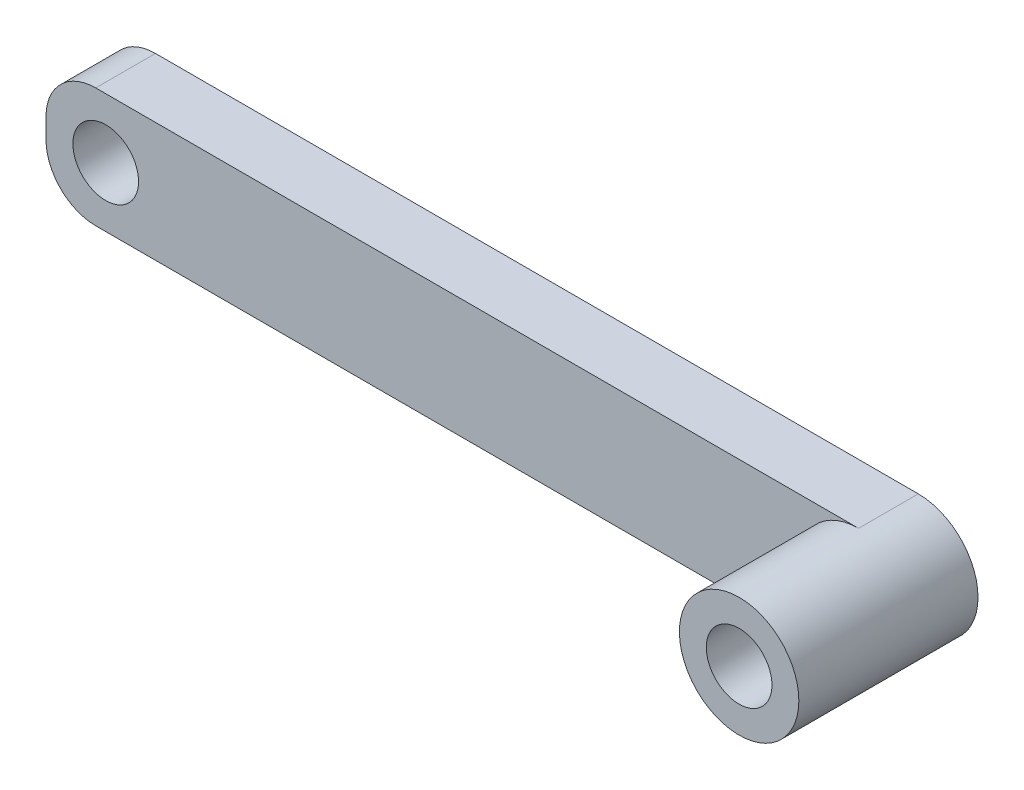
ISO-10303-21;
HEADER;
FILE_DESCRIPTION(('STEP AP214'),'2;1');
FILE_NAME('part.step','',(''),(''),'','','');
FILE_SCHEMA(('AUTOMOTIVE_DESIGN { 1 0 10303 214 1 1 1 1 }'));
ENDSEC;
DATA;
#1=APPLICATION_CONTEXT('core data for automotive mechanical design processes');
#2=APPLICATION_PROTOCOL_DEFINITION('international standard','automotive_design',2000,#1);
#3=PRODUCT_CONTEXT('',#1,'mechanical');
#4=PRODUCT('Part','Part','',(#3));
#5=PRODUCT_RELATED_PRODUCT_CATEGORY('part','',(#4));
#6=PRODUCT_DEFINITION_FORMATION('','',#4);
#7=PRODUCT_DEFINITION_CONTEXT('part definition',#1,'design');
#8=PRODUCT_DEFINITION('design','',#6,#7);
#9=PRODUCT_DEFINITION_SHAPE('','',#8);
#10=(LENGTH_UNIT() NAMED_UNIT(*) SI_UNIT(.MILLI.,.METRE.));
#11=(NAMED_UNIT(*) PLANE_ANGLE_UNIT() SI_UNIT($,.RADIAN.));
#12=(NAMED_UNIT(*) SI_UNIT($,.STERADIAN.) SOLID_ANGLE_UNIT());
#13=UNCERTAINTY_MEASURE_WITH_UNIT(LENGTH_MEASURE(1.E-05),#10,'distance_accuracy_value','');
#14=(GEOMETRIC_REPRESENTATION_CONTEXT(3) GLOBAL_UNCERTAINTY_ASSIGNED_CONTEXT((#13)) GLOBAL_UNIT_ASSIGNED_CONTEXT((#10,
#11,#12)) REPRESENTATION_CONTEXT('',''));
#15=CARTESIAN_POINT('',(0.,0.,0.));
#16=DIRECTION('',(0.,0.,1.));
#17=DIRECTION('',(1.,0.,0.));
#18=AXIS2_PLACEMENT_3D('',#15,#16,#17);
#19=CARTESIAN_POINT('',(0.,3.,3.));
#20=DIRECTION('',(0.,1.,0.));
#21=DIRECTION('',(0.,0.,1.));
#22=AXIS2_PLACEMENT_3D('',#19,#20,#21);
#23=PLANE('',#22);
#24=DIRECTION('',(1.,0.,0.));
#25=VECTOR('',#24,1.);
#26=CARTESIAN_POINT('',(0.,3.,0.));
#27=LINE('',#26,#25);
#28=CARTESIAN_POINT('',(-19.41,3.,0.));
#29=VERTEX_POINT('',#28);
#30=CARTESIAN_POINT('',(18.91,3.,0.));
#31=VERTEX_POINT('',#30);
#32=EDGE_CURVE('E95',#29,#31,#27,.T.);
#33=ORIENTED_EDGE('',*,*,#32,.F.);
#34=DIRECTION('',(0.,0.,-1.));
#35=VECTOR('',#34,1.);
#36=CARTESIAN_POINT('',(-19.41,3.,3.));
#37=LINE('',#36,#35);
#38=CARTESIAN_POINT('',(-19.41,3.,3.));
#39=VERTEX_POINT('',#38);
#40=EDGE_CURVE('E11',#29,#39,#37,.F.);
#41=ORIENTED_EDGE('',*,*,#40,.T.);
#42=DIRECTION('',(1.,0.,0.));
#43=VECTOR('',#42,1.);
#44=CARTESIAN_POINT('',(0.,3.,3.));
#45=LINE('',#44,#43);
#46=CARTESIAN_POINT('',(18.91,3.,3.));
#47=VERTEX_POINT('',#46);
#48=EDGE_CURVE('E120',#39,#47,#45,.T.);
#49=ORIENTED_EDGE('',*,*,#48,.T.);
#50=DIRECTION('',(0.,0.,-1.));
#51=VECTOR('',#50,1.);
#52=CARTESIAN_POINT('',(18.91,3.,3.));
#53=LINE('',#52,#51);
#54=EDGE_CURVE('E113',#47,#31,#53,.T.);
#55=ORIENTED_EDGE('',*,*,#54,.T.);
#56=EDGE_LOOP('',(#33,#41,#49,#55));
#57=FACE_BOUND('',#56,.T.);
#58=ADVANCED_FACE('F41',(#57),#23,.T.);
#59=CARTESIAN_POINT('',(-21.91,0.,3.));
#60=DIRECTION('',(1.,0.,0.));
#61=DIRECTION('',(0.,0.,-1.));
#62=AXIS2_PLACEMENT_3D('',#59,#60,#61);
#63=PLANE('',#62);
#64=DIRECTION('',(0.,-1.,0.));
#65=VECTOR('',#64,1.);
#66=CARTESIAN_POINT('',(-21.91,0.,0.));
#67=LINE('',#66,#65);
#68=CARTESIAN_POINT('',(-21.91,0.5,0.));
#69=VERTEX_POINT('',#68);
#70=CARTESIAN_POINT('',(-21.91,-0.5,0.));
#71=VERTEX_POINT('',#70);
#72=EDGE_CURVE('E106',#69,#71,#67,.T.);
#73=ORIENTED_EDGE('',*,*,#72,.T.);
#74=DIRECTION('',(0.,0.,-1.));
#75=VECTOR('',#74,1.);
#76=CARTESIAN_POINT('',(-21.91,-0.5,3.));
#77=LINE('',#76,#75);
#78=CARTESIAN_POINT('',(-21.91,-0.5,3.));
#79=VERTEX_POINT('',#78);
#80=EDGE_CURVE('E63',#71,#79,#77,.F.);
#81=ORIENTED_EDGE('',*,*,#80,.T.);
#82=DIRECTION('',(0.,-1.,0.));
#83=VECTOR('',#82,1.);
#84=CARTESIAN_POINT('',(-21.91,0.,3.));
#85=LINE('',#84,#83);
#86=CARTESIAN_POINT('',(-21.91,0.5,3.));
#87=VERTEX_POINT('',#86);
#88=EDGE_CURVE('E150',#87,#79,#85,.T.);
#89=ORIENTED_EDGE('',*,*,#88,.F.);
#90=DIRECTION('',(0.,0.,-1.));
#91=VECTOR('',#90,1.);
#92=CARTESIAN_POINT('',(-21.91,0.5,0.));
#93=LINE('',#92,#91);
#94=EDGE_CURVE('E137',#87,#69,#93,.T.);
#95=ORIENTED_EDGE('',*,*,#94,.T.);
#96=EDGE_LOOP('',(#73,#81,#89,#95));
#97=FACE_BOUND('',#96,.T.);
#98=ADVANCED_FACE('F159',(#97),#63,.F.);
#99=CARTESIAN_POINT('',(-18.91,0.,3.));
#100=DIRECTION('',(0.,0.,-1.));
#101=DIRECTION('',(-1.,0.,0.));
#102=AXIS2_PLACEMENT_3D('',#99,#100,#101);
#103=CYLINDRICAL_SURFACE('',#102,1.65);
#104=CARTESIAN_POINT('',(-18.91,0.,3.));
#105=DIRECTION('',(0.,0.,1.));
#106=DIRECTION('',(1.,0.,0.));
#107=AXIS2_PLACEMENT_3D('',#104,#105,#106);
#108=CIRCLE('',#107,1.65);
#109=CARTESIAN_POINT('',(-17.26,0.,3.));
#110=VERTEX_POINT('',#109);
#111=EDGE_CURVE('E164',#110,#110,#108,.T.);
#112=ORIENTED_EDGE('',*,*,#111,.T.);
#113=EDGE_LOOP('',(#112));
#114=FACE_BOUND('',#113,.T.);
#115=CARTESIAN_POINT('',(-18.91,0.,0.));
#116=DIRECTION('',(0.,0.,1.));
#117=DIRECTION('',(1.,0.,0.));
#118=AXIS2_PLACEMENT_3D('',#115,#116,#117);
#119=CIRCLE('',#118,1.65);
#120=CARTESIAN_POINT('',(-17.26,0.,0.));
#121=VERTEX_POINT('',#120);
#122=EDGE_CURVE('E107',#121,#121,#119,.T.);
#123=ORIENTED_EDGE('',*,*,#122,.F.);
#124=EDGE_LOOP('',(#123));
#125=FACE_BOUND('',#124,.T.);
#126=ADVANCED_FACE('F211',(#114,#125),#103,.F.);
#127=CARTESIAN_POINT('',(0.,-3.,3.));
#128=DIRECTION('',(0.,1.,0.));
#129=DIRECTION('',(0.,0.,1.));
#130=AXIS2_PLACEMENT_3D('',#127,#128,#129);
#131=PLANE('',#130);
#132=DIRECTION('',(1.,0.,0.));
#133=VECTOR('',#132,1.);
#134=CARTESIAN_POINT('',(0.,-3.,3.));
#135=LINE('',#134,#133);
#136=CARTESIAN_POINT('',(-19.41,-3.,3.));
#137=VERTEX_POINT('',#136);
#138=CARTESIAN_POINT('',(18.91,-3.,3.));
#139=VERTEX_POINT('',#138);
#140=EDGE_CURVE('E128',#137,#139,#135,.T.);
#141=ORIENTED_EDGE('',*,*,#140,.F.);
#142=DIRECTION('',(0.,0.,-1.));
#143=VECTOR('',#142,1.);
#144=CARTESIAN_POINT('',(-19.41,-3.,3.));
#145=LINE('',#144,#143);
#146=CARTESIAN_POINT('',(-19.41,-3.,0.));
#147=VERTEX_POINT('',#146);
#148=EDGE_CURVE('E122',#137,#147,#145,.T.);
#149=ORIENTED_EDGE('',*,*,#148,.T.);
#150=DIRECTION('',(1.,0.,0.));
#151=VECTOR('',#150,1.);
#152=CARTESIAN_POINT('',(0.,-3.,0.));
#153=LINE('',#152,#151);
#154=CARTESIAN_POINT('',(18.91,-3.,0.));
#155=VERTEX_POINT('',#154);
#156=EDGE_CURVE('E158',#147,#155,#153,.T.);
#157=ORIENTED_EDGE('',*,*,#156,.T.);
#158=DIRECTION('',(0.,0.,-1.));
#159=VECTOR('',#158,1.);
#160=CARTESIAN_POINT('',(18.91,-3.,3.));
#161=LINE('',#160,#159);
#162=EDGE_CURVE('E116',#139,#155,#161,.T.);
#163=ORIENTED_EDGE('',*,*,#162,.F.);
#164=EDGE_LOOP('',(#141,#149,#157,#163));
#165=FACE_BOUND('',#164,.T.);
#166=ADVANCED_FACE('F154',(#165),#131,.F.);
#167=CARTESIAN_POINT('',(0.,0.,3.));
#168=DIRECTION('',(0.,0.,1.));
#169=DIRECTION('',(1.,0.,0.));
#170=AXIS2_PLACEMENT_3D('',#167,#168,#169);
#171=PLANE('',#170);
#172=ORIENTED_EDGE('',*,*,#111,.F.);
#173=EDGE_LOOP('',(#172));
#174=FACE_BOUND('',#173,.T.);
#175=ORIENTED_EDGE('',*,*,#88,.T.);
#176=CARTESIAN_POINT('',(-19.41,-0.5,3.));
#177=DIRECTION('',(0.,0.,1.));
#178=DIRECTION('',(1.,0.,0.));
#179=AXIS2_PLACEMENT_3D('',#176,#177,#178);
#180=CIRCLE('',#179,2.5);
#181=EDGE_CURVE('E50',#79,#137,#180,.T.);
#182=ORIENTED_EDGE('',*,*,#181,.T.);
#183=ORIENTED_EDGE('',*,*,#140,.T.);
#184=CARTESIAN_POINT('',(18.91,0.,3.));
#185=DIRECTION('',(0.,0.,1.));
#186=DIRECTION('',(1.,0.,0.));
#187=AXIS2_PLACEMENT_3D('',#184,#185,#186);
#188=CIRCLE('',#187,3.);
#189=EDGE_CURVE('E174',#47,#139,#188,.T.);
#190=ORIENTED_EDGE('',*,*,#189,.F.);
#191=ORIENTED_EDGE('',*,*,#48,.F.);
#192=CARTESIAN_POINT('',(-19.41,0.5,3.));
#193=DIRECTION('',(0.,0.,1.));
#194=DIRECTION('',(1.,0.,0.));
#195=AXIS2_PLACEMENT_3D('',#192,#193,#194);
#196=CIRCLE('',#195,2.5);
#197=EDGE_CURVE('E143',#39,#87,#196,.T.);
#198=ORIENTED_EDGE('',*,*,#197,.T.);
#199=EDGE_LOOP('',(#175,#182,#183,#190,#191,#198));
#200=FACE_BOUND('',#199,.T.);
#201=ADVANCED_FACE('F149',(#174,#200),#171,.T.);
#202=CARTESIAN_POINT('',(0.,0.,0.));
#203=DIRECTION('',(0.,0.,1.));
#204=DIRECTION('',(1.,0.,0.));
#205=AXIS2_PLACEMENT_3D('',#202,#203,#204);
#206=PLANE('',#205);
#207=ORIENTED_EDGE('',*,*,#122,.T.);
#208=EDGE_LOOP('',(#207));
#209=FACE_BOUND('',#208,.T.);
#210=ORIENTED_EDGE('',*,*,#156,.F.);
#211=CARTESIAN_POINT('',(-19.41,-0.5,0.));
#212=DIRECTION('',(0.,0.,1.));
#213=DIRECTION('',(1.,0.,0.));
#214=AXIS2_PLACEMENT_3D('',#211,#212,#213);
#215=CIRCLE('',#214,2.5);
#216=EDGE_CURVE('E134',#147,#71,#215,.F.);
#217=ORIENTED_EDGE('',*,*,#216,.T.);
#218=ORIENTED_EDGE('',*,*,#72,.F.);
#219=CARTESIAN_POINT('',(-19.41,0.5,0.));
#220=DIRECTION('',(0.,0.,1.));
#221=DIRECTION('',(1.,0.,0.));
#222=AXIS2_PLACEMENT_3D('',#219,#220,#221);
#223=CIRCLE('',#222,2.5);
#224=EDGE_CURVE('E103',#69,#29,#223,.F.);
#225=ORIENTED_EDGE('',*,*,#224,.T.);
#226=ORIENTED_EDGE('',*,*,#32,.T.);
#227=CARTESIAN_POINT('',(18.91,0.,0.));
#228=DIRECTION('',(0.,0.,1.));
#229=DIRECTION('',(1.,0.,0.));
#230=AXIS2_PLACEMENT_3D('',#227,#228,#229);
#231=CIRCLE('',#230,3.);
#232=EDGE_CURVE('E100',#155,#31,#231,.T.);
#233=ORIENTED_EDGE('',*,*,#232,.F.);
#234=EDGE_LOOP('',(#210,#217,#218,#225,#226,#233));
#235=FACE_BOUND('',#234,.T.);
#236=CARTESIAN_POINT('',(18.91,0.,0.));
#237=DIRECTION('',(0.,0.,1.));
#238=DIRECTION('',(1.,0.,0.));
#239=AXIS2_PLACEMENT_3D('',#236,#237,#238);
#240=CIRCLE('',#239,1.65);
#241=CARTESIAN_POINT('',(20.56,0.,0.));
#242=VERTEX_POINT('',#241);
#243=EDGE_CURVE('E118',#242,#242,#240,.T.);
#244=ORIENTED_EDGE('',*,*,#243,.T.);
#245=EDGE_LOOP('',(#244));
#246=FACE_BOUND('',#245,.T.);
#247=ADVANCED_FACE('F98',(#209,#235,#246),#206,.F.);
#248=CARTESIAN_POINT('',(18.91,0.,9.));
#249=DIRECTION('',(0.,0.,-1.));
#250=DIRECTION('',(-1.,0.,0.));
#251=AXIS2_PLACEMENT_3D('',#248,#249,#250);
#252=CYLINDRICAL_SURFACE('',#251,3.);
#253=CARTESIAN_POINT('',(18.91,0.,9.));
#254=DIRECTION('',(0.,0.,1.));
#255=DIRECTION('',(1.,0.,0.));
#256=AXIS2_PLACEMENT_3D('',#253,#254,#255);
#257=CIRCLE('',#256,3.);
#258=CARTESIAN_POINT('',(21.91,0.,9.));
#259=VERTEX_POINT('',#258);
#260=EDGE_CURVE('E182',#259,#259,#257,.T.);
#261=ORIENTED_EDGE('',*,*,#260,.F.);
#262=EDGE_LOOP('',(#261));
#263=FACE_BOUND('',#262,.T.);
#264=ORIENTED_EDGE('',*,*,#232,.T.);
#265=ORIENTED_EDGE('',*,*,#54,.F.);
#266=ORIENTED_EDGE('',*,*,#189,.T.);
#267=ORIENTED_EDGE('',*,*,#162,.T.);
#268=EDGE_LOOP('',(#264,#265,#266,#267));
#269=FACE_BOUND('',#268,.T.);
#270=ADVANCED_FACE('F111',(#263,#269),#252,.T.);
#271=CARTESIAN_POINT('',(18.91,0.,9.));
#272=DIRECTION('',(0.,0.,-1.));
#273=DIRECTION('',(-1.,0.,0.));
#274=AXIS2_PLACEMENT_3D('',#271,#272,#273);
#275=CYLINDRICAL_SURFACE('',#274,1.65);
#276=CARTESIAN_POINT('',(18.91,0.,9.));
#277=DIRECTION('',(0.,0.,1.));
#278=DIRECTION('',(1.,0.,0.));
#279=AXIS2_PLACEMENT_3D('',#276,#277,#278);
#280=CIRCLE('',#279,1.65);
#281=CARTESIAN_POINT('',(20.56,0.,9.));
#282=VERTEX_POINT('',#281);
#283=EDGE_CURVE('E168',#282,#282,#280,.T.);
#284=ORIENTED_EDGE('',*,*,#283,.T.);
#285=EDGE_LOOP('',(#284));
#286=FACE_BOUND('',#285,.T.);
#287=ORIENTED_EDGE('',*,*,#243,.F.);
#288=EDGE_LOOP('',(#287));
#289=FACE_BOUND('',#288,.T.);
#290=ADVANCED_FACE('F195',(#286,#289),#275,.F.);
#291=CARTESIAN_POINT('',(0.,0.,9.));
#292=DIRECTION('',(0.,0.,1.));
#293=DIRECTION('',(1.,0.,0.));
#294=AXIS2_PLACEMENT_3D('',#291,#292,#293);
#295=PLANE('',#294);
#296=ORIENTED_EDGE('',*,*,#260,.T.);
#297=EDGE_LOOP('',(#296));
#298=FACE_BOUND('',#297,.T.);
#299=ORIENTED_EDGE('',*,*,#283,.F.);
#300=EDGE_LOOP('',(#299));
#301=FACE_BOUND('',#300,.T.);
#302=ADVANCED_FACE('F191',(#298,#301),#295,.T.);
#303=CARTESIAN_POINT('',(-19.41,-0.5,3.));
#304=DIRECTION('',(0.,0.,-1.));
#305=DIRECTION('',(-1.,0.,0.));
#306=AXIS2_PLACEMENT_3D('',#303,#304,#305);
#307=CYLINDRICAL_SURFACE('',#306,2.5);
#308=ORIENTED_EDGE('',*,*,#181,.F.);
#309=ORIENTED_EDGE('',*,*,#80,.F.);
#310=ORIENTED_EDGE('',*,*,#216,.F.);
#311=ORIENTED_EDGE('',*,*,#148,.F.);
#312=EDGE_LOOP('',(#308,#309,#310,#311));
#313=FACE_BOUND('',#312,.T.);
#314=ADVANCED_FACE('F157',(#313),#307,.T.);
#315=CARTESIAN_POINT('',(-19.41,0.5,3.));
#316=DIRECTION('',(0.,0.,1.));
#317=DIRECTION('',(1.,0.,0.));
#318=AXIS2_PLACEMENT_3D('',#315,#316,#317);
#319=CYLINDRICAL_SURFACE('',#318,2.5);
#320=ORIENTED_EDGE('',*,*,#197,.F.);
#321=ORIENTED_EDGE('',*,*,#40,.F.);
#322=ORIENTED_EDGE('',*,*,#224,.F.);
#323=ORIENTED_EDGE('',*,*,#94,.F.);
#324=EDGE_LOOP('',(#320,#321,#322,#323));
#325=FACE_BOUND('',#324,.T.);
#326=ADVANCED_FACE('F43',(#325),#319,.T.);
#327=CLOSED_SHELL('',(#58,#98,#126,#166,#201,#247,#270,#290,#302,#314,#326));
#328=MANIFOLD_SOLID_BREP('B2',#327);
#329=ADVANCED_BREP_SHAPE_REPRESENTATION('',(#18,#328),#14);
#330=SHAPE_DEFINITION_REPRESENTATION(#9,#329);
ENDSEC;
END-ISO-10303-21;
